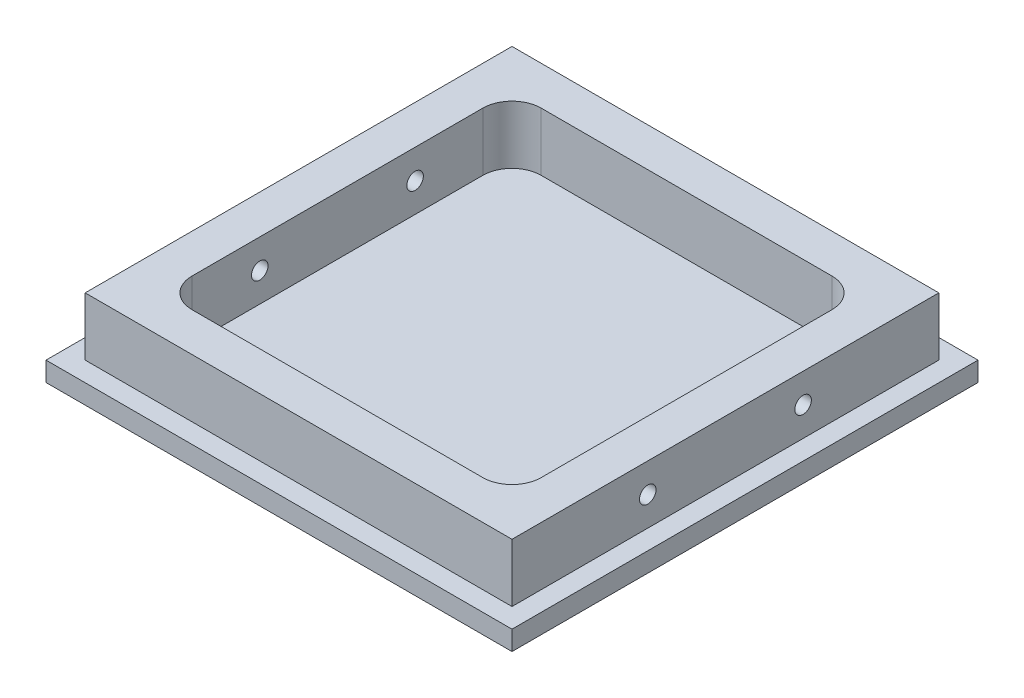
ISO-10303-21;
HEADER;
FILE_DESCRIPTION(('STEP AP214'),'2;1');
FILE_NAME('part.step','',(''),(''),'','','');
FILE_SCHEMA(('AUTOMOTIVE_DESIGN { 1 0 10303 214 1 1 1 1 }'));
ENDSEC;
DATA;
#1=APPLICATION_CONTEXT('core data for automotive mechanical design processes');
#2=APPLICATION_PROTOCOL_DEFINITION('international standard','automotive_design',2000,#1);
#3=PRODUCT_CONTEXT('',#1,'mechanical');
#4=PRODUCT('Part','Part','',(#3));
#5=PRODUCT_RELATED_PRODUCT_CATEGORY('part','',(#4));
#6=PRODUCT_DEFINITION_FORMATION('','',#4);
#7=PRODUCT_DEFINITION_CONTEXT('part definition',#1,'design');
#8=PRODUCT_DEFINITION('design','',#6,#7);
#9=PRODUCT_DEFINITION_SHAPE('','',#8);
#10=(LENGTH_UNIT() NAMED_UNIT(*) SI_UNIT(.MILLI.,.METRE.));
#11=(NAMED_UNIT(*) PLANE_ANGLE_UNIT() SI_UNIT($,.RADIAN.));
#12=(NAMED_UNIT(*) SI_UNIT($,.STERADIAN.) SOLID_ANGLE_UNIT());
#13=UNCERTAINTY_MEASURE_WITH_UNIT(LENGTH_MEASURE(1.E-05),#10,'distance_accuracy_value','');
#14=(GEOMETRIC_REPRESENTATION_CONTEXT(3) GLOBAL_UNCERTAINTY_ASSIGNED_CONTEXT((#13)) GLOBAL_UNIT_ASSIGNED_CONTEXT((#10,
#11,#12)) REPRESENTATION_CONTEXT('',''));
#15=CARTESIAN_POINT('',(0.,0.,0.));
#16=DIRECTION('',(0.,0.,1.));
#17=DIRECTION('',(1.,0.,0.));
#18=AXIS2_PLACEMENT_3D('',#15,#16,#17);
#19=CARTESIAN_POINT('',(0.,3.175,0.));
#20=DIRECTION('',(0.,-1.,0.));
#21=DIRECTION('',(0.,0.,-1.));
#22=AXIS2_PLACEMENT_3D('',#19,#20,#21);
#23=PLANE('',#22);
#24=DIRECTION('',(0.,0.,-1.));
#25=VECTOR('',#24,1.);
#26=CARTESIAN_POINT('',(38.1,3.175,38.1));
#27=LINE('',#26,#25);
#28=CARTESIAN_POINT('',(38.1,3.175,38.1));
#29=VERTEX_POINT('',#28);
#30=CARTESIAN_POINT('',(38.1,3.175,-38.1));
#31=VERTEX_POINT('',#30);
#32=EDGE_CURVE('E186',#29,#31,#27,.T.);
#33=ORIENTED_EDGE('',*,*,#32,.T.);
#34=DIRECTION('',(-1.,0.,0.));
#35=VECTOR('',#34,1.);
#36=CARTESIAN_POINT('',(-38.1,3.175,-38.1));
#37=LINE('',#36,#35);
#38=CARTESIAN_POINT('',(-38.1,3.175,-38.1));
#39=VERTEX_POINT('',#38);
#40=EDGE_CURVE('E189',#31,#39,#37,.T.);
#41=ORIENTED_EDGE('',*,*,#40,.T.);
#42=DIRECTION('',(0.,0.,1.));
#43=VECTOR('',#42,1.);
#44=CARTESIAN_POINT('',(-38.1,3.175,38.1));
#45=LINE('',#44,#43);
#46=CARTESIAN_POINT('',(-38.1,3.175,38.1));
#47=VERTEX_POINT('',#46);
#48=EDGE_CURVE('E192',#39,#47,#45,.T.);
#49=ORIENTED_EDGE('',*,*,#48,.T.);
#50=DIRECTION('',(1.,0.,0.));
#51=VECTOR('',#50,1.);
#52=CARTESIAN_POINT('',(-38.1,3.175,38.1));
#53=LINE('',#52,#51);
#54=EDGE_CURVE('E194',#47,#29,#53,.T.);
#55=ORIENTED_EDGE('',*,*,#54,.T.);
#56=EDGE_LOOP('',(#33,#41,#49,#55));
#57=FACE_BOUND('',#56,.T.);
#58=DIRECTION('',(0.,0.,1.));
#59=VECTOR('',#58,1.);
#60=CARTESIAN_POINT('',(-34.89706,3.175,34.89706));
#61=LINE('',#60,#59);
#62=CARTESIAN_POINT('',(-34.89706,3.175,-34.89706));
#63=VERTEX_POINT('',#62);
#64=CARTESIAN_POINT('',(-34.89706,3.175,34.89706));
#65=VERTEX_POINT('',#64);
#66=EDGE_CURVE('E176',#63,#65,#61,.T.);
#67=ORIENTED_EDGE('',*,*,#66,.F.);
#68=DIRECTION('',(-1.,0.,0.));
#69=VECTOR('',#68,1.);
#70=CARTESIAN_POINT('',(34.89706,3.175,-34.89706));
#71=LINE('',#70,#69);
#72=CARTESIAN_POINT('',(34.89706,3.175,-34.89706));
#73=VERTEX_POINT('',#72);
#74=EDGE_CURVE('E173',#73,#63,#71,.T.);
#75=ORIENTED_EDGE('',*,*,#74,.F.);
#76=DIRECTION('',(0.,0.,-1.));
#77=VECTOR('',#76,1.);
#78=CARTESIAN_POINT('',(34.89706,3.175,34.89706));
#79=LINE('',#78,#77);
#80=CARTESIAN_POINT('',(34.89706,3.175,34.89706));
#81=VERTEX_POINT('',#80);
#82=EDGE_CURVE('E297',#81,#73,#79,.T.);
#83=ORIENTED_EDGE('',*,*,#82,.F.);
#84=DIRECTION('',(1.,0.,0.));
#85=VECTOR('',#84,1.);
#86=CARTESIAN_POINT('',(34.89706,3.175,34.89706));
#87=LINE('',#86,#85);
#88=EDGE_CURVE('E295',#65,#81,#87,.T.);
#89=ORIENTED_EDGE('',*,*,#88,.F.);
#90=EDGE_LOOP('',(#67,#75,#83,#89));
#91=FACE_BOUND('',#90,.T.);
#92=ADVANCED_FACE('F37',(#57,#91),#23,.F.);
#93=CARTESIAN_POINT('',(38.1,3.175,38.1));
#94=DIRECTION('',(-1.,0.,0.));
#95=DIRECTION('',(0.,0.,1.));
#96=AXIS2_PLACEMENT_3D('',#93,#94,#95);
#97=PLANE('',#96);
#98=DIRECTION('',(0.,0.,-1.));
#99=VECTOR('',#98,1.);
#100=CARTESIAN_POINT('',(38.1,0.,38.1));
#101=LINE('',#100,#99);
#102=CARTESIAN_POINT('',(38.1,0.,38.1));
#103=VERTEX_POINT('',#102);
#104=CARTESIAN_POINT('',(38.1,0.,-38.1));
#105=VERTEX_POINT('',#104);
#106=EDGE_CURVE('E177',#103,#105,#101,.T.);
#107=ORIENTED_EDGE('',*,*,#106,.T.);
#108=DIRECTION('',(0.,-1.,0.));
#109=VECTOR('',#108,1.);
#110=CARTESIAN_POINT('',(38.1,3.175,-38.1));
#111=LINE('',#110,#109);
#112=EDGE_CURVE('E209',#31,#105,#111,.T.);
#113=ORIENTED_EDGE('',*,*,#112,.F.);
#114=ORIENTED_EDGE('',*,*,#32,.F.);
#115=DIRECTION('',(0.,-1.,0.));
#116=VECTOR('',#115,1.);
#117=CARTESIAN_POINT('',(38.1,3.175,38.1));
#118=LINE('',#117,#116);
#119=EDGE_CURVE('E195',#29,#103,#118,.T.);
#120=ORIENTED_EDGE('',*,*,#119,.T.);
#121=EDGE_LOOP('',(#107,#113,#114,#120));
#122=FACE_BOUND('',#121,.T.);
#123=ADVANCED_FACE('F310',(#122),#97,.F.);
#124=CARTESIAN_POINT('',(-38.1,3.175,-38.1));
#125=DIRECTION('',(0.,0.,1.));
#126=DIRECTION('',(1.,0.,0.));
#127=AXIS2_PLACEMENT_3D('',#124,#125,#126);
#128=PLANE('',#127);
#129=DIRECTION('',(-1.,0.,0.));
#130=VECTOR('',#129,1.);
#131=CARTESIAN_POINT('',(-38.1,0.,-38.1));
#132=LINE('',#131,#130);
#133=CARTESIAN_POINT('',(-38.1,0.,-38.1));
#134=VERTEX_POINT('',#133);
#135=EDGE_CURVE('E180',#105,#134,#132,.T.);
#136=ORIENTED_EDGE('',*,*,#135,.T.);
#137=DIRECTION('',(0.,-1.,0.));
#138=VECTOR('',#137,1.);
#139=CARTESIAN_POINT('',(-38.1,3.175,-38.1));
#140=LINE('',#139,#138);
#141=EDGE_CURVE('E206',#39,#134,#140,.T.);
#142=ORIENTED_EDGE('',*,*,#141,.F.);
#143=ORIENTED_EDGE('',*,*,#40,.F.);
#144=ORIENTED_EDGE('',*,*,#112,.T.);
#145=EDGE_LOOP('',(#136,#142,#143,#144));
#146=FACE_BOUND('',#145,.T.);
#147=ADVANCED_FACE('F317',(#146),#128,.F.);
#148=CARTESIAN_POINT('',(-38.1,3.175,38.1));
#149=DIRECTION('',(1.,0.,0.));
#150=DIRECTION('',(0.,0.,-1.));
#151=AXIS2_PLACEMENT_3D('',#148,#149,#150);
#152=PLANE('',#151);
#153=DIRECTION('',(0.,0.,1.));
#154=VECTOR('',#153,1.);
#155=CARTESIAN_POINT('',(-38.1,0.,38.1));
#156=LINE('',#155,#154);
#157=CARTESIAN_POINT('',(-38.1,0.,38.1));
#158=VERTEX_POINT('',#157);
#159=EDGE_CURVE('E198',#134,#158,#156,.T.);
#160=ORIENTED_EDGE('',*,*,#159,.T.);
#161=DIRECTION('',(0.,-1.,0.));
#162=VECTOR('',#161,1.);
#163=CARTESIAN_POINT('',(-38.1,3.175,38.1));
#164=LINE('',#163,#162);
#165=EDGE_CURVE('E203',#47,#158,#164,.T.);
#166=ORIENTED_EDGE('',*,*,#165,.F.);
#167=ORIENTED_EDGE('',*,*,#48,.F.);
#168=ORIENTED_EDGE('',*,*,#141,.T.);
#169=EDGE_LOOP('',(#160,#166,#167,#168));
#170=FACE_BOUND('',#169,.T.);
#171=ADVANCED_FACE('F422',(#170),#152,.F.);
#172=CARTESIAN_POINT('',(-38.1,3.175,38.1));
#173=DIRECTION('',(0.,0.,-1.));
#174=DIRECTION('',(-1.,0.,0.));
#175=AXIS2_PLACEMENT_3D('',#172,#173,#174);
#176=PLANE('',#175);
#177=DIRECTION('',(1.,0.,0.));
#178=VECTOR('',#177,1.);
#179=CARTESIAN_POINT('',(-38.1,0.,38.1));
#180=LINE('',#179,#178);
#181=EDGE_CURVE('E190',#158,#103,#180,.T.);
#182=ORIENTED_EDGE('',*,*,#181,.T.);
#183=ORIENTED_EDGE('',*,*,#119,.F.);
#184=ORIENTED_EDGE('',*,*,#54,.F.);
#185=ORIENTED_EDGE('',*,*,#165,.T.);
#186=EDGE_LOOP('',(#182,#183,#184,#185));
#187=FACE_BOUND('',#186,.T.);
#188=ADVANCED_FACE('F426',(#187),#176,.F.);
#189=CARTESIAN_POINT('',(0.,0.,0.));
#190=DIRECTION('',(0.,-1.,0.));
#191=DIRECTION('',(0.,0.,-1.));
#192=AXIS2_PLACEMENT_3D('',#189,#190,#191);
#193=PLANE('',#192);
#194=ORIENTED_EDGE('',*,*,#106,.F.);
#195=ORIENTED_EDGE('',*,*,#181,.F.);
#196=ORIENTED_EDGE('',*,*,#159,.F.);
#197=ORIENTED_EDGE('',*,*,#135,.F.);
#198=EDGE_LOOP('',(#194,#195,#196,#197));
#199=FACE_BOUND('',#198,.T.);
#200=ADVANCED_FACE('F372',(#199),#193,.T.);
#201=CARTESIAN_POINT('',(0.,12.7,0.));
#202=DIRECTION('',(0.,1.,0.));
#203=DIRECTION('',(0.,0.,1.));
#204=AXIS2_PLACEMENT_3D('',#201,#202,#203);
#205=PLANE('',#204);
#206=DIRECTION('',(0.,0.,1.));
#207=VECTOR('',#206,1.);
#208=CARTESIAN_POINT('',(-34.89706,12.7,34.89706));
#209=LINE('',#208,#207);
#210=CARTESIAN_POINT('',(-34.89706,12.7,-34.89706));
#211=VERTEX_POINT('',#210);
#212=CARTESIAN_POINT('',(-34.89706,12.7,34.89706));
#213=VERTEX_POINT('',#212);
#214=EDGE_CURVE('E164',#211,#213,#209,.T.);
#215=ORIENTED_EDGE('',*,*,#214,.T.);
#216=DIRECTION('',(1.,0.,0.));
#217=VECTOR('',#216,1.);
#218=CARTESIAN_POINT('',(34.89706,12.7,34.89706));
#219=LINE('',#218,#217);
#220=CARTESIAN_POINT('',(34.89706,12.7,34.89706));
#221=VERTEX_POINT('',#220);
#222=EDGE_CURVE('E152',#213,#221,#219,.T.);
#223=ORIENTED_EDGE('',*,*,#222,.T.);
#224=DIRECTION('',(0.,0.,-1.));
#225=VECTOR('',#224,1.);
#226=CARTESIAN_POINT('',(34.89706,12.7,34.89706));
#227=LINE('',#226,#225);
#228=CARTESIAN_POINT('',(34.89706,12.7,-34.89706));
#229=VERTEX_POINT('',#228);
#230=EDGE_CURVE('E163',#221,#229,#227,.T.);
#231=ORIENTED_EDGE('',*,*,#230,.T.);
#232=DIRECTION('',(-1.,0.,0.));
#233=VECTOR('',#232,1.);
#234=CARTESIAN_POINT('',(34.89706,12.7,-34.89706));
#235=LINE('',#234,#233);
#236=EDGE_CURVE('E169',#229,#211,#235,.T.);
#237=ORIENTED_EDGE('',*,*,#236,.T.);
#238=EDGE_LOOP('',(#215,#223,#231,#237));
#239=FACE_BOUND('',#238,.T.);
#240=DIRECTION('',(1.,0.,0.));
#241=VECTOR('',#240,1.);
#242=CARTESIAN_POINT('',(28.54706,12.7,28.54706));
#243=LINE('',#242,#241);
#244=CARTESIAN_POINT('',(-23.78456,12.7,28.54706));
#245=VERTEX_POINT('',#244);
#246=CARTESIAN_POINT('',(23.78456,12.7,28.54706));
#247=VERTEX_POINT('',#246);
#248=EDGE_CURVE('E272',#245,#247,#243,.T.);
#249=ORIENTED_EDGE('',*,*,#248,.F.);
#250=CARTESIAN_POINT('',(-23.78456,12.7,23.78456));
#251=DIRECTION('',(0.,1.,0.));
#252=DIRECTION('',(0.,0.,1.));
#253=AXIS2_PLACEMENT_3D('',#250,#251,#252);
#254=CIRCLE('',#253,4.7625);
#255=CARTESIAN_POINT('',(-28.54706,12.7,23.78456));
#256=VERTEX_POINT('',#255);
#257=EDGE_CURVE('E239',#245,#256,#254,.F.);
#258=ORIENTED_EDGE('',*,*,#257,.T.);
#259=DIRECTION('',(0.,0.,1.));
#260=VECTOR('',#259,1.);
#261=CARTESIAN_POINT('',(-28.54706,12.7,28.54706));
#262=LINE('',#261,#260);
#263=CARTESIAN_POINT('',(-28.54706,12.7,-23.78456));
#264=VERTEX_POINT('',#263);
#265=EDGE_CURVE('E269',#264,#256,#262,.T.);
#266=ORIENTED_EDGE('',*,*,#265,.F.);
#267=CARTESIAN_POINT('',(-23.78456,12.7,-23.78456));
#268=DIRECTION('',(0.,1.,0.));
#269=DIRECTION('',(0.,0.,1.));
#270=AXIS2_PLACEMENT_3D('',#267,#268,#269);
#271=CIRCLE('',#270,4.7625);
#272=CARTESIAN_POINT('',(-23.78456,12.7,-28.54706));
#273=VERTEX_POINT('',#272);
#274=EDGE_CURVE('E11',#264,#273,#271,.F.);
#275=ORIENTED_EDGE('',*,*,#274,.T.);
#276=DIRECTION('',(-1.,0.,0.));
#277=VECTOR('',#276,1.);
#278=CARTESIAN_POINT('',(28.54706,12.7,-28.54706));
#279=LINE('',#278,#277);
#280=CARTESIAN_POINT('',(23.78456,12.7,-28.54706));
#281=VERTEX_POINT('',#280);
#282=EDGE_CURVE('E279',#281,#273,#279,.T.);
#283=ORIENTED_EDGE('',*,*,#282,.F.);
#284=CARTESIAN_POINT('',(23.78456,12.7,-23.78456));
#285=DIRECTION('',(0.,1.,0.));
#286=DIRECTION('',(0.,0.,1.));
#287=AXIS2_PLACEMENT_3D('',#284,#285,#286);
#288=CIRCLE('',#287,4.7625);
#289=CARTESIAN_POINT('',(28.54706,12.7,-23.78456));
#290=VERTEX_POINT('',#289);
#291=EDGE_CURVE('E46',#281,#290,#288,.F.);
#292=ORIENTED_EDGE('',*,*,#291,.T.);
#293=DIRECTION('',(0.,0.,-1.));
#294=VECTOR('',#293,1.);
#295=CARTESIAN_POINT('',(28.54706,12.7,28.54706));
#296=LINE('',#295,#294);
#297=CARTESIAN_POINT('',(28.54706,12.7,23.78456));
#298=VERTEX_POINT('',#297);
#299=EDGE_CURVE('E276',#298,#290,#296,.T.);
#300=ORIENTED_EDGE('',*,*,#299,.F.);
#301=CARTESIAN_POINT('',(23.78456,12.7,23.78456));
#302=DIRECTION('',(0.,1.,0.));
#303=DIRECTION('',(0.,0.,1.));
#304=AXIS2_PLACEMENT_3D('',#301,#302,#303);
#305=CIRCLE('',#304,4.7625);
#306=EDGE_CURVE('E241',#298,#247,#305,.F.);
#307=ORIENTED_EDGE('',*,*,#306,.T.);
#308=EDGE_LOOP('',(#249,#258,#266,#275,#283,#292,#300,#307));
#309=FACE_BOUND('',#308,.T.);
#310=ADVANCED_FACE('F167',(#239,#309),#205,.T.);
#311=CARTESIAN_POINT('',(-34.89706,12.7,34.89706));
#312=DIRECTION('',(1.,0.,0.));
#313=DIRECTION('',(0.,0.,-1.));
#314=AXIS2_PLACEMENT_3D('',#311,#312,#313);
#315=PLANE('',#314);
#316=CARTESIAN_POINT('',(-34.89706,7.9375,12.7));
#317=DIRECTION('',(-1.,0.,0.));
#318=DIRECTION('',(0.,0.,1.));
#319=AXIS2_PLACEMENT_3D('',#316,#317,#318);
#320=CIRCLE('',#319,1.35255);
#321=CARTESIAN_POINT('',(-34.89706,7.9375,14.05255));
#322=VERTEX_POINT('',#321);
#323=EDGE_CURVE('E257',#322,#322,#320,.T.);
#324=ORIENTED_EDGE('',*,*,#323,.F.);
#325=EDGE_LOOP('',(#324));
#326=FACE_BOUND('',#325,.T.);
#327=CARTESIAN_POINT('',(-34.89706,7.9375,-12.7));
#328=DIRECTION('',(-1.,0.,0.));
#329=DIRECTION('',(0.,0.,1.));
#330=AXIS2_PLACEMENT_3D('',#327,#328,#329);
#331=CIRCLE('',#330,1.35255);
#332=CARTESIAN_POINT('',(-34.89706,7.9375,-11.34745));
#333=VERTEX_POINT('',#332);
#334=EDGE_CURVE('E246',#333,#333,#331,.T.);
#335=ORIENTED_EDGE('',*,*,#334,.F.);
#336=EDGE_LOOP('',(#335));
#337=FACE_BOUND('',#336,.T.);
#338=ORIENTED_EDGE('',*,*,#66,.T.);
#339=DIRECTION('',(0.,-1.,0.));
#340=VECTOR('',#339,1.);
#341=CARTESIAN_POINT('',(-34.89706,12.7,34.89706));
#342=LINE('',#341,#340);
#343=EDGE_CURVE('E157',#213,#65,#342,.T.);
#344=ORIENTED_EDGE('',*,*,#343,.F.);
#345=ORIENTED_EDGE('',*,*,#214,.F.);
#346=DIRECTION('',(0.,-1.,0.));
#347=VECTOR('',#346,1.);
#348=CARTESIAN_POINT('',(-34.89706,12.7,-34.89706));
#349=LINE('',#348,#347);
#350=EDGE_CURVE('E293',#211,#63,#349,.T.);
#351=ORIENTED_EDGE('',*,*,#350,.T.);
#352=EDGE_LOOP('',(#338,#344,#345,#351));
#353=FACE_BOUND('',#352,.T.);
#354=ADVANCED_FACE('F175',(#326,#337,#353),#315,.F.);
#355=CARTESIAN_POINT('',(34.89706,12.7,34.89706));
#356=DIRECTION('',(0.,0.,-1.));
#357=DIRECTION('',(-1.,0.,0.));
#358=AXIS2_PLACEMENT_3D('',#355,#356,#357);
#359=PLANE('',#358);
#360=ORIENTED_EDGE('',*,*,#88,.T.);
#361=DIRECTION('',(0.,-1.,0.));
#362=VECTOR('',#361,1.);
#363=CARTESIAN_POINT('',(34.89706,12.7,34.89706));
#364=LINE('',#363,#362);
#365=EDGE_CURVE('E160',#221,#81,#364,.T.);
#366=ORIENTED_EDGE('',*,*,#365,.F.);
#367=ORIENTED_EDGE('',*,*,#222,.F.);
#368=ORIENTED_EDGE('',*,*,#343,.T.);
#369=EDGE_LOOP('',(#360,#366,#367,#368));
#370=FACE_BOUND('',#369,.T.);
#371=ADVANCED_FACE('F155',(#370),#359,.F.);
#372=CARTESIAN_POINT('',(34.89706,12.7,34.89706));
#373=DIRECTION('',(-1.,0.,0.));
#374=DIRECTION('',(0.,0.,1.));
#375=AXIS2_PLACEMENT_3D('',#372,#373,#374);
#376=PLANE('',#375);
#377=CARTESIAN_POINT('',(34.89706,7.9375,-12.7));
#378=DIRECTION('',(1.,0.,0.));
#379=DIRECTION('',(0.,0.,-1.));
#380=AXIS2_PLACEMENT_3D('',#377,#378,#379);
#381=CIRCLE('',#380,1.35255);
#382=CARTESIAN_POINT('',(34.89706,7.9375,-14.05255));
#383=VERTEX_POINT('',#382);
#384=EDGE_CURVE('E245',#383,#383,#381,.T.);
#385=ORIENTED_EDGE('',*,*,#384,.F.);
#386=EDGE_LOOP('',(#385));
#387=FACE_BOUND('',#386,.T.);
#388=CARTESIAN_POINT('',(34.89706,7.9375,12.7));
#389=DIRECTION('',(1.,0.,0.));
#390=DIRECTION('',(0.,0.,-1.));
#391=AXIS2_PLACEMENT_3D('',#388,#389,#390);
#392=CIRCLE('',#391,1.35255);
#393=CARTESIAN_POINT('',(34.89706,7.9375,11.34745));
#394=VERTEX_POINT('',#393);
#395=EDGE_CURVE('E262',#394,#394,#392,.T.);
#396=ORIENTED_EDGE('',*,*,#395,.F.);
#397=EDGE_LOOP('',(#396));
#398=FACE_BOUND('',#397,.T.);
#399=ORIENTED_EDGE('',*,*,#82,.T.);
#400=DIRECTION('',(0.,-1.,0.));
#401=VECTOR('',#400,1.);
#402=CARTESIAN_POINT('',(34.89706,12.7,-34.89706));
#403=LINE('',#402,#401);
#404=EDGE_CURVE('E182',#229,#73,#403,.T.);
#405=ORIENTED_EDGE('',*,*,#404,.F.);
#406=ORIENTED_EDGE('',*,*,#230,.F.);
#407=ORIENTED_EDGE('',*,*,#365,.T.);
#408=EDGE_LOOP('',(#399,#405,#406,#407));
#409=FACE_BOUND('',#408,.T.);
#410=ADVANCED_FACE('F307',(#387,#398,#409),#376,.F.);
#411=CARTESIAN_POINT('',(34.89706,12.7,-34.89706));
#412=DIRECTION('',(0.,0.,1.));
#413=DIRECTION('',(1.,0.,0.));
#414=AXIS2_PLACEMENT_3D('',#411,#412,#413);
#415=PLANE('',#414);
#416=ORIENTED_EDGE('',*,*,#74,.T.);
#417=ORIENTED_EDGE('',*,*,#350,.F.);
#418=ORIENTED_EDGE('',*,*,#236,.F.);
#419=ORIENTED_EDGE('',*,*,#404,.T.);
#420=EDGE_LOOP('',(#416,#417,#418,#419));
#421=FACE_BOUND('',#420,.T.);
#422=ADVANCED_FACE('F305',(#421),#415,.F.);
#423=CARTESIAN_POINT('',(-28.54706,12.7,28.54706));
#424=DIRECTION('',(1.,0.,0.));
#425=DIRECTION('',(0.,0.,-1.));
#426=AXIS2_PLACEMENT_3D('',#423,#424,#425);
#427=PLANE('',#426);
#428=CARTESIAN_POINT('',(-28.54706,7.9375,12.7));
#429=DIRECTION('',(1.,0.,0.));
#430=DIRECTION('',(0.,0.,-1.));
#431=AXIS2_PLACEMENT_3D('',#428,#429,#430);
#432=CIRCLE('',#431,1.35255);
#433=CARTESIAN_POINT('',(-28.54706,7.9375,11.34745));
#434=VERTEX_POINT('',#433);
#435=EDGE_CURVE('E41',#434,#434,#432,.T.);
#436=ORIENTED_EDGE('',*,*,#435,.F.);
#437=EDGE_LOOP('',(#436));
#438=FACE_BOUND('',#437,.T.);
#439=CARTESIAN_POINT('',(-28.54706,7.9375,-12.7));
#440=DIRECTION('',(1.,0.,0.));
#441=DIRECTION('',(0.,0.,-1.));
#442=AXIS2_PLACEMENT_3D('',#439,#440,#441);
#443=CIRCLE('',#442,1.35255);
#444=CARTESIAN_POINT('',(-28.54706,7.9375,-14.05255));
#445=VERTEX_POINT('',#444);
#446=EDGE_CURVE('E243',#445,#445,#443,.T.);
#447=ORIENTED_EDGE('',*,*,#446,.F.);
#448=EDGE_LOOP('',(#447));
#449=FACE_BOUND('',#448,.T.);
#450=ORIENTED_EDGE('',*,*,#265,.T.);
#451=DIRECTION('',(0.,-1.,0.));
#452=VECTOR('',#451,1.);
#453=CARTESIAN_POINT('',(-28.54706,3.175,23.78456));
#454=LINE('',#453,#452);
#455=CARTESIAN_POINT('',(-28.54706,3.175,23.78456));
#456=VERTEX_POINT('',#455);
#457=EDGE_CURVE('E214',#256,#456,#454,.T.);
#458=ORIENTED_EDGE('',*,*,#457,.T.);
#459=DIRECTION('',(0.,0.,1.));
#460=VECTOR('',#459,1.);
#461=CARTESIAN_POINT('',(-28.54706,3.175,28.54706));
#462=LINE('',#461,#460);
#463=CARTESIAN_POINT('',(-28.54706,3.175,-23.78456));
#464=VERTEX_POINT('',#463);
#465=EDGE_CURVE('E268',#464,#456,#462,.T.);
#466=ORIENTED_EDGE('',*,*,#465,.F.);
#467=DIRECTION('',(0.,-1.,0.));
#468=VECTOR('',#467,1.);
#469=CARTESIAN_POINT('',(-28.54706,12.7,-23.78456));
#470=LINE('',#469,#468);
#471=EDGE_CURVE('E212',#464,#264,#470,.F.);
#472=ORIENTED_EDGE('',*,*,#471,.T.);
#473=EDGE_LOOP('',(#450,#458,#466,#472));
#474=FACE_BOUND('',#473,.T.);
#475=ADVANCED_FACE('F339',(#438,#449,#474),#427,.T.);
#476=CARTESIAN_POINT('',(28.54706,12.7,28.54706));
#477=DIRECTION('',(0.,0.,-1.));
#478=DIRECTION('',(-1.,0.,0.));
#479=AXIS2_PLACEMENT_3D('',#476,#477,#478);
#480=PLANE('',#479);
#481=DIRECTION('',(1.,0.,0.));
#482=VECTOR('',#481,1.);
#483=CARTESIAN_POINT('',(28.54706,3.175,28.54706));
#484=LINE('',#483,#482);
#485=CARTESIAN_POINT('',(-23.78456,3.175,28.54706));
#486=VERTEX_POINT('',#485);
#487=CARTESIAN_POINT('',(23.78456,3.175,28.54706));
#488=VERTEX_POINT('',#487);
#489=EDGE_CURVE('E283',#486,#488,#484,.T.);
#490=ORIENTED_EDGE('',*,*,#489,.F.);
#491=DIRECTION('',(0.,-1.,0.));
#492=VECTOR('',#491,1.);
#493=CARTESIAN_POINT('',(-23.78456,12.7,28.54706));
#494=LINE('',#493,#492);
#495=EDGE_CURVE('E228',#486,#245,#494,.F.);
#496=ORIENTED_EDGE('',*,*,#495,.T.);
#497=ORIENTED_EDGE('',*,*,#248,.T.);
#498=DIRECTION('',(0.,-1.,0.));
#499=VECTOR('',#498,1.);
#500=CARTESIAN_POINT('',(23.78456,3.175,28.54706));
#501=LINE('',#500,#499);
#502=EDGE_CURVE('E225',#247,#488,#501,.T.);
#503=ORIENTED_EDGE('',*,*,#502,.T.);
#504=EDGE_LOOP('',(#490,#496,#497,#503));
#505=FACE_BOUND('',#504,.T.);
#506=ADVANCED_FACE('F356',(#505),#480,.T.);
#507=CARTESIAN_POINT('',(28.54706,12.7,28.54706));
#508=DIRECTION('',(-1.,0.,0.));
#509=DIRECTION('',(0.,0.,1.));
#510=AXIS2_PLACEMENT_3D('',#507,#508,#509);
#511=PLANE('',#510);
#512=CARTESIAN_POINT('',(28.54706,7.9375,-12.7));
#513=DIRECTION('',(-1.,0.,0.));
#514=DIRECTION('',(0.,0.,1.));
#515=AXIS2_PLACEMENT_3D('',#512,#513,#514);
#516=CIRCLE('',#515,1.35255);
#517=CARTESIAN_POINT('',(28.54706,7.9375,-11.34745));
#518=VERTEX_POINT('',#517);
#519=EDGE_CURVE('E250',#518,#518,#516,.T.);
#520=ORIENTED_EDGE('',*,*,#519,.F.);
#521=EDGE_LOOP('',(#520));
#522=FACE_BOUND('',#521,.T.);
#523=CARTESIAN_POINT('',(28.54706,7.9375,12.7));
#524=DIRECTION('',(-1.,0.,0.));
#525=DIRECTION('',(0.,0.,1.));
#526=AXIS2_PLACEMENT_3D('',#523,#524,#525);
#527=CIRCLE('',#526,1.35255);
#528=CARTESIAN_POINT('',(28.54706,7.9375,14.05255));
#529=VERTEX_POINT('',#528);
#530=EDGE_CURVE('E265',#529,#529,#527,.T.);
#531=ORIENTED_EDGE('',*,*,#530,.F.);
#532=EDGE_LOOP('',(#531));
#533=FACE_BOUND('',#532,.T.);
#534=DIRECTION('',(0.,0.,-1.));
#535=VECTOR('',#534,1.);
#536=CARTESIAN_POINT('',(28.54706,3.175,28.54706));
#537=LINE('',#536,#535);
#538=CARTESIAN_POINT('',(28.54706,3.175,23.78456));
#539=VERTEX_POINT('',#538);
#540=CARTESIAN_POINT('',(28.54706,3.175,-23.78456));
#541=VERTEX_POINT('',#540);
#542=EDGE_CURVE('E286',#539,#541,#537,.T.);
#543=ORIENTED_EDGE('',*,*,#542,.F.);
#544=DIRECTION('',(0.,-1.,0.));
#545=VECTOR('',#544,1.);
#546=CARTESIAN_POINT('',(28.54706,12.7,23.78456));
#547=LINE('',#546,#545);
#548=EDGE_CURVE('E233',#539,#298,#547,.F.);
#549=ORIENTED_EDGE('',*,*,#548,.T.);
#550=ORIENTED_EDGE('',*,*,#299,.T.);
#551=DIRECTION('',(0.,-1.,0.));
#552=VECTOR('',#551,1.);
#553=CARTESIAN_POINT('',(28.54706,3.175,-23.78456));
#554=LINE('',#553,#552);
#555=EDGE_CURVE('E230',#290,#541,#554,.T.);
#556=ORIENTED_EDGE('',*,*,#555,.T.);
#557=EDGE_LOOP('',(#543,#549,#550,#556));
#558=FACE_BOUND('',#557,.T.);
#559=ADVANCED_FACE('F333',(#522,#533,#558),#511,.T.);
#560=CARTESIAN_POINT('',(28.54706,12.7,-28.54706));
#561=DIRECTION('',(0.,0.,1.));
#562=DIRECTION('',(1.,0.,0.));
#563=AXIS2_PLACEMENT_3D('',#560,#561,#562);
#564=PLANE('',#563);
#565=DIRECTION('',(-1.,0.,0.));
#566=VECTOR('',#565,1.);
#567=CARTESIAN_POINT('',(28.54706,3.175,-28.54706));
#568=LINE('',#567,#566);
#569=CARTESIAN_POINT('',(23.78456,3.175,-28.54706));
#570=VERTEX_POINT('',#569);
#571=CARTESIAN_POINT('',(-23.78456,3.175,-28.54706));
#572=VERTEX_POINT('',#571);
#573=EDGE_CURVE('E273',#570,#572,#568,.T.);
#574=ORIENTED_EDGE('',*,*,#573,.F.);
#575=DIRECTION('',(0.,-1.,0.));
#576=VECTOR('',#575,1.);
#577=CARTESIAN_POINT('',(23.78456,12.7,-28.54706));
#578=LINE('',#577,#576);
#579=EDGE_CURVE('E59',#570,#281,#578,.F.);
#580=ORIENTED_EDGE('',*,*,#579,.T.);
#581=ORIENTED_EDGE('',*,*,#282,.T.);
#582=DIRECTION('',(0.,-1.,0.));
#583=VECTOR('',#582,1.);
#584=CARTESIAN_POINT('',(-23.78456,3.175,-28.54706));
#585=LINE('',#584,#583);
#586=EDGE_CURVE('E235',#273,#572,#585,.T.);
#587=ORIENTED_EDGE('',*,*,#586,.T.);
#588=EDGE_LOOP('',(#574,#580,#581,#587));
#589=FACE_BOUND('',#588,.T.);
#590=ADVANCED_FACE('F324',(#589),#564,.T.);
#591=ORIENTED_EDGE('',*,*,#465,.T.);
#592=CARTESIAN_POINT('',(-23.78456,3.175,23.78456));
#593=DIRECTION('',(0.,-1.,0.));
#594=DIRECTION('',(0.,0.,-1.));
#595=AXIS2_PLACEMENT_3D('',#592,#593,#594);
#596=CIRCLE('',#595,4.7625);
#597=EDGE_CURVE('E223',#456,#486,#596,.F.);
#598=ORIENTED_EDGE('',*,*,#597,.T.);
#599=ORIENTED_EDGE('',*,*,#489,.T.);
#600=CARTESIAN_POINT('',(23.78456,3.175,23.78456));
#601=DIRECTION('',(0.,-1.,0.));
#602=DIRECTION('',(0.,0.,-1.));
#603=AXIS2_PLACEMENT_3D('',#600,#601,#602);
#604=CIRCLE('',#603,4.7625);
#605=EDGE_CURVE('E221',#488,#539,#604,.F.);
#606=ORIENTED_EDGE('',*,*,#605,.T.);
#607=ORIENTED_EDGE('',*,*,#542,.T.);
#608=CARTESIAN_POINT('',(23.78456,3.175,-23.78456));
#609=DIRECTION('',(0.,-1.,0.));
#610=DIRECTION('',(0.,0.,-1.));
#611=AXIS2_PLACEMENT_3D('',#608,#609,#610);
#612=CIRCLE('',#611,4.7625);
#613=EDGE_CURVE('E219',#541,#570,#612,.F.);
#614=ORIENTED_EDGE('',*,*,#613,.T.);
#615=ORIENTED_EDGE('',*,*,#573,.T.);
#616=CARTESIAN_POINT('',(-23.78456,3.175,-23.78456));
#617=DIRECTION('',(0.,-1.,0.));
#618=DIRECTION('',(0.,0.,-1.));
#619=AXIS2_PLACEMENT_3D('',#616,#617,#618);
#620=CIRCLE('',#619,4.7625);
#621=EDGE_CURVE('E217',#572,#464,#620,.F.);
#622=ORIENTED_EDGE('',*,*,#621,.T.);
#623=EDGE_LOOP('',(#591,#598,#599,#606,#607,#614,#615,#622));
#624=FACE_BOUND('',#623,.T.);
#625=ADVANCED_FACE('F313',(#624),#23,.F.);
#626=CARTESIAN_POINT('',(-23.78456,12.7,23.78456));
#627=DIRECTION('',(0.,1.,0.));
#628=DIRECTION('',(0.,0.,1.));
#629=AXIS2_PLACEMENT_3D('',#626,#627,#628);
#630=CYLINDRICAL_SURFACE('',#629,4.7625);
#631=ORIENTED_EDGE('',*,*,#257,.F.);
#632=ORIENTED_EDGE('',*,*,#495,.F.);
#633=ORIENTED_EDGE('',*,*,#597,.F.);
#634=ORIENTED_EDGE('',*,*,#457,.F.);
#635=EDGE_LOOP('',(#631,#632,#633,#634));
#636=FACE_BOUND('',#635,.T.);
#637=ADVANCED_FACE('F323',(#636),#630,.F.);
#638=CARTESIAN_POINT('',(23.78456,12.7,23.78456));
#639=DIRECTION('',(0.,1.,0.));
#640=DIRECTION('',(0.,0.,1.));
#641=AXIS2_PLACEMENT_3D('',#638,#639,#640);
#642=CYLINDRICAL_SURFACE('',#641,4.7625);
#643=ORIENTED_EDGE('',*,*,#306,.F.);
#644=ORIENTED_EDGE('',*,*,#548,.F.);
#645=ORIENTED_EDGE('',*,*,#605,.F.);
#646=ORIENTED_EDGE('',*,*,#502,.F.);
#647=EDGE_LOOP('',(#643,#644,#645,#646));
#648=FACE_BOUND('',#647,.T.);
#649=ADVANCED_FACE('F330',(#648),#642,.F.);
#650=CARTESIAN_POINT('',(23.78456,12.7,-23.78456));
#651=DIRECTION('',(0.,1.,0.));
#652=DIRECTION('',(0.,0.,1.));
#653=AXIS2_PLACEMENT_3D('',#650,#651,#652);
#654=CYLINDRICAL_SURFACE('',#653,4.7625);
#655=ORIENTED_EDGE('',*,*,#291,.F.);
#656=ORIENTED_EDGE('',*,*,#579,.F.);
#657=ORIENTED_EDGE('',*,*,#613,.F.);
#658=ORIENTED_EDGE('',*,*,#555,.F.);
#659=EDGE_LOOP('',(#655,#656,#657,#658));
#660=FACE_BOUND('',#659,.T.);
#661=ADVANCED_FACE('F347',(#660),#654,.F.);
#662=CARTESIAN_POINT('',(-23.78456,12.7,-23.78456));
#663=DIRECTION('',(0.,1.,0.));
#664=DIRECTION('',(0.,0.,1.));
#665=AXIS2_PLACEMENT_3D('',#662,#663,#664);
#666=CYLINDRICAL_SURFACE('',#665,4.7625);
#667=ORIENTED_EDGE('',*,*,#274,.F.);
#668=ORIENTED_EDGE('',*,*,#471,.F.);
#669=ORIENTED_EDGE('',*,*,#621,.F.);
#670=ORIENTED_EDGE('',*,*,#586,.F.);
#671=EDGE_LOOP('',(#667,#668,#669,#670));
#672=FACE_BOUND('',#671,.T.);
#673=ADVANCED_FACE('F39',(#672),#666,.F.);
#674=CARTESIAN_POINT('',(34.89706,7.9375,12.7));
#675=DIRECTION('',(1.,0.,0.));
#676=DIRECTION('',(0.,0.,-1.));
#677=AXIS2_PLACEMENT_3D('',#674,#675,#676);
#678=CYLINDRICAL_SURFACE('',#677,1.35255);
#679=ORIENTED_EDGE('',*,*,#530,.T.);
#680=EDGE_LOOP('',(#679));
#681=FACE_BOUND('',#680,.T.);
#682=ORIENTED_EDGE('',*,*,#395,.T.);
#683=EDGE_LOOP('',(#682));
#684=FACE_BOUND('',#683,.T.);
#685=ADVANCED_FACE('F400',(#681,#684),#678,.F.);
#686=CARTESIAN_POINT('',(34.89706,7.9375,-12.7));
#687=DIRECTION('',(1.,0.,0.));
#688=DIRECTION('',(0.,0.,-1.));
#689=AXIS2_PLACEMENT_3D('',#686,#687,#688);
#690=CYLINDRICAL_SURFACE('',#689,1.35255);
#691=ORIENTED_EDGE('',*,*,#519,.T.);
#692=EDGE_LOOP('',(#691));
#693=FACE_BOUND('',#692,.T.);
#694=ORIENTED_EDGE('',*,*,#384,.T.);
#695=EDGE_LOOP('',(#694));
#696=FACE_BOUND('',#695,.T.);
#697=ADVANCED_FACE('F395',(#693,#696),#690,.F.);
#698=CARTESIAN_POINT('',(-34.89706,7.9375,-12.7));
#699=DIRECTION('',(-1.,0.,0.));
#700=DIRECTION('',(0.,0.,1.));
#701=AXIS2_PLACEMENT_3D('',#698,#699,#700);
#702=CYLINDRICAL_SURFACE('',#701,1.35255);
#703=ORIENTED_EDGE('',*,*,#446,.T.);
#704=EDGE_LOOP('',(#703));
#705=FACE_BOUND('',#704,.T.);
#706=ORIENTED_EDGE('',*,*,#334,.T.);
#707=EDGE_LOOP('',(#706));
#708=FACE_BOUND('',#707,.T.);
#709=ADVANCED_FACE('F389',(#705,#708),#702,.F.);
#710=CARTESIAN_POINT('',(-34.89706,7.9375,12.7));
#711=DIRECTION('',(-1.,0.,0.));
#712=DIRECTION('',(0.,0.,1.));
#713=AXIS2_PLACEMENT_3D('',#710,#711,#712);
#714=CYLINDRICAL_SURFACE('',#713,1.35255);
#715=ORIENTED_EDGE('',*,*,#435,.T.);
#716=EDGE_LOOP('',(#715));
#717=FACE_BOUND('',#716,.T.);
#718=ORIENTED_EDGE('',*,*,#323,.T.);
#719=EDGE_LOOP('',(#718));
#720=FACE_BOUND('',#719,.T.);
#721=ADVANCED_FACE('F387',(#717,#720),#714,.F.);
#722=CLOSED_SHELL('',(#92,#123,#147,#171,#188,#200,#310,#354,#371,#410,#422,#475,#506,#559,#590,
#625,#637,#649,#661,#673,#685,#697,#709,#721));
#723=MANIFOLD_SOLID_BREP('B2',#722);
#724=ADVANCED_BREP_SHAPE_REPRESENTATION('',(#18,#723),#14);
#725=SHAPE_DEFINITION_REPRESENTATION(#9,#724);
ENDSEC;
END-ISO-10303-21;
